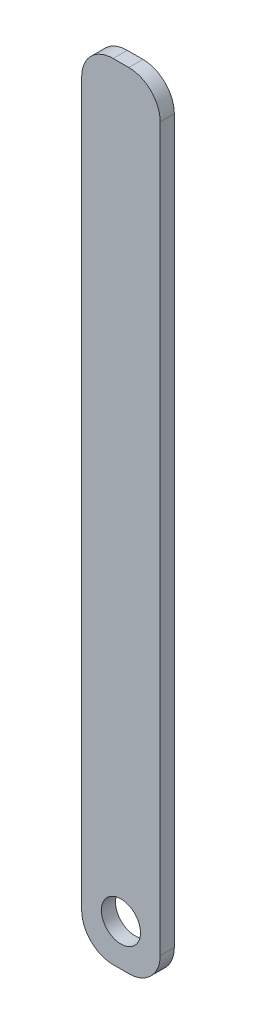
ISO-10303-21;
HEADER;
FILE_DESCRIPTION(('STEP AP214'),'2;1');
FILE_NAME('part.step','',(''),(''),'','','');
FILE_SCHEMA(('AUTOMOTIVE_DESIGN { 1 0 10303 214 1 1 1 1 }'));
ENDSEC;
DATA;
#1=APPLICATION_CONTEXT('core data for automotive mechanical design processes');
#2=APPLICATION_PROTOCOL_DEFINITION('international standard','automotive_design',2000,#1);
#3=PRODUCT_CONTEXT('',#1,'mechanical');
#4=PRODUCT('Part','Part','',(#3));
#5=PRODUCT_RELATED_PRODUCT_CATEGORY('part','',(#4));
#6=PRODUCT_DEFINITION_FORMATION('','',#4);
#7=PRODUCT_DEFINITION_CONTEXT('part definition',#1,'design');
#8=PRODUCT_DEFINITION('design','',#6,#7);
#9=PRODUCT_DEFINITION_SHAPE('','',#8);
#10=(LENGTH_UNIT() NAMED_UNIT(*) SI_UNIT(.MILLI.,.METRE.));
#11=(NAMED_UNIT(*) PLANE_ANGLE_UNIT() SI_UNIT($,.RADIAN.));
#12=(NAMED_UNIT(*) SI_UNIT($,.STERADIAN.) SOLID_ANGLE_UNIT());
#13=UNCERTAINTY_MEASURE_WITH_UNIT(LENGTH_MEASURE(1.E-05),#10,'distance_accuracy_value','');
#14=(GEOMETRIC_REPRESENTATION_CONTEXT(3) GLOBAL_UNCERTAINTY_ASSIGNED_CONTEXT((#13)) GLOBAL_UNIT_ASSIGNED_CONTEXT((#10,
#11,#12)) REPRESENTATION_CONTEXT('',''));
#15=CARTESIAN_POINT('',(0.,0.,0.));
#16=DIRECTION('',(0.,0.,1.));
#17=DIRECTION('',(1.,0.,0.));
#18=AXIS2_PLACEMENT_3D('',#15,#16,#17);
#19=CARTESIAN_POINT('',(-12.7000000000001,-271.4,4.5));
#20=DIRECTION('',(1.,0.,0.));
#21=DIRECTION('',(0.,0.,-1.));
#22=AXIS2_PLACEMENT_3D('',#19,#20,#21);
#23=PLANE('',#22);
#24=DIRECTION('',(0.,-1.,0.));
#25=VECTOR('',#24,1.);
#26=CARTESIAN_POINT('',(-12.7000000000001,-271.4,-4.5));
#27=LINE('',#26,#25);
#28=CARTESIAN_POINT('',(-12.7000000000001,208.6,-4.5));
#29=VERTEX_POINT('',#28);
#30=CARTESIAN_POINT('',(-12.7000000000001,-251.4,-4.5));
#31=VERTEX_POINT('',#30);
#32=EDGE_CURVE('E147',#29,#31,#27,.T.);
#33=ORIENTED_EDGE('',*,*,#32,.T.);
#34=DIRECTION('',(0.,0.,-1.));
#35=VECTOR('',#34,1.);
#36=CARTESIAN_POINT('',(-12.7000000000001,-251.4,4.5));
#37=LINE('',#36,#35);
#38=CARTESIAN_POINT('',(-12.7000000000001,-251.4,4.5));
#39=VERTEX_POINT('',#38);
#40=EDGE_CURVE('E181',#31,#39,#37,.F.);
#41=ORIENTED_EDGE('',*,*,#40,.T.);
#42=DIRECTION('',(0.,-1.,0.));
#43=VECTOR('',#42,1.);
#44=CARTESIAN_POINT('',(-12.7000000000001,-271.4,4.5));
#45=LINE('',#44,#43);
#46=CARTESIAN_POINT('',(-12.7000000000001,208.6,4.5));
#47=VERTEX_POINT('',#46);
#48=EDGE_CURVE('E145',#47,#39,#45,.T.);
#49=ORIENTED_EDGE('',*,*,#48,.F.);
#50=DIRECTION('',(0.,0.,-1.));
#51=VECTOR('',#50,1.);
#52=CARTESIAN_POINT('',(-12.7000000000001,208.6,4.5));
#53=LINE('',#52,#51);
#54=EDGE_CURVE('E177',#47,#29,#53,.T.);
#55=ORIENTED_EDGE('',*,*,#54,.T.);
#56=EDGE_LOOP('',(#33,#41,#49,#55));
#57=FACE_BOUND('',#56,.T.);
#58=ADVANCED_FACE('F45',(#57),#23,.F.);
#59=CARTESIAN_POINT('',(37.2999999999999,-271.4,4.5));
#60=DIRECTION('',(0.,1.,0.));
#61=DIRECTION('',(0.,0.,1.));
#62=AXIS2_PLACEMENT_3D('',#59,#60,#61);
#63=PLANE('',#62);
#64=DIRECTION('',(1.,0.,0.));
#65=VECTOR('',#64,1.);
#66=CARTESIAN_POINT('',(37.2999999999999,-271.4,-4.5));
#67=LINE('',#66,#65);
#68=CARTESIAN_POINT('',(7.29999999999993,-271.4,-4.5));
#69=VERTEX_POINT('',#68);
#70=CARTESIAN_POINT('',(17.2999999999999,-271.4,-4.5));
#71=VERTEX_POINT('',#70);
#72=EDGE_CURVE('E141',#69,#71,#67,.T.);
#73=ORIENTED_EDGE('',*,*,#72,.T.);
#74=DIRECTION('',(0.,0.,-1.));
#75=VECTOR('',#74,1.);
#76=CARTESIAN_POINT('',(17.2999999999999,-271.4,4.5));
#77=LINE('',#76,#75);
#78=CARTESIAN_POINT('',(17.2999999999999,-271.4,4.5));
#79=VERTEX_POINT('',#78);
#80=EDGE_CURVE('E117',#71,#79,#77,.F.);
#81=ORIENTED_EDGE('',*,*,#80,.T.);
#82=DIRECTION('',(1.,0.,0.));
#83=VECTOR('',#82,1.);
#84=CARTESIAN_POINT('',(37.2999999999999,-271.4,4.5));
#85=LINE('',#84,#83);
#86=CARTESIAN_POINT('',(7.29999999999993,-271.4,4.5));
#87=VERTEX_POINT('',#86);
#88=EDGE_CURVE('E201',#87,#79,#85,.T.);
#89=ORIENTED_EDGE('',*,*,#88,.F.);
#90=DIRECTION('',(0.,0.,-1.));
#91=VECTOR('',#90,1.);
#92=CARTESIAN_POINT('',(7.29999999999993,-271.4,4.5));
#93=LINE('',#92,#91);
#94=EDGE_CURVE('E123',#87,#69,#93,.T.);
#95=ORIENTED_EDGE('',*,*,#94,.T.);
#96=EDGE_LOOP('',(#73,#81,#89,#95));
#97=FACE_BOUND('',#96,.T.);
#98=ADVANCED_FACE('F230',(#97),#63,.F.);
#99=CARTESIAN_POINT('',(37.2999999999999,-271.4,4.5));
#100=DIRECTION('',(-1.,0.,0.));
#101=DIRECTION('',(0.,0.,1.));
#102=AXIS2_PLACEMENT_3D('',#99,#100,#101);
#103=PLANE('',#102);
#104=DIRECTION('',(0.,1.,0.));
#105=VECTOR('',#104,1.);
#106=CARTESIAN_POINT('',(37.2999999999999,-271.4,4.5));
#107=LINE('',#106,#105);
#108=CARTESIAN_POINT('',(37.2999999999999,-251.4,4.5));
#109=VERTEX_POINT('',#108);
#110=CARTESIAN_POINT('',(37.2999999999999,208.6,4.5));
#111=VERTEX_POINT('',#110);
#112=EDGE_CURVE('E132',#109,#111,#107,.T.);
#113=ORIENTED_EDGE('',*,*,#112,.F.);
#114=DIRECTION('',(0.,0.,-1.));
#115=VECTOR('',#114,1.);
#116=CARTESIAN_POINT('',(37.2999999999999,-251.4,4.5));
#117=LINE('',#116,#115);
#118=CARTESIAN_POINT('',(37.2999999999999,-251.4,-4.5));
#119=VERTEX_POINT('',#118);
#120=EDGE_CURVE('E116',#109,#119,#117,.T.);
#121=ORIENTED_EDGE('',*,*,#120,.T.);
#122=DIRECTION('',(0.,1.,0.));
#123=VECTOR('',#122,1.);
#124=CARTESIAN_POINT('',(37.2999999999999,-271.4,-4.5));
#125=LINE('',#124,#123);
#126=CARTESIAN_POINT('',(37.2999999999999,208.6,-4.5));
#127=VERTEX_POINT('',#126);
#128=EDGE_CURVE('E130',#119,#127,#125,.T.);
#129=ORIENTED_EDGE('',*,*,#128,.T.);
#130=DIRECTION('',(0.,0.,-1.));
#131=VECTOR('',#130,1.);
#132=CARTESIAN_POINT('',(37.2999999999999,208.6,4.5));
#133=LINE('',#132,#131);
#134=EDGE_CURVE('E135',#127,#111,#133,.F.);
#135=ORIENTED_EDGE('',*,*,#134,.T.);
#136=EDGE_LOOP('',(#113,#121,#129,#135));
#137=FACE_BOUND('',#136,.T.);
#138=ADVANCED_FACE('F129',(#137),#103,.F.);
#139=CARTESIAN_POINT('',(37.2999999999999,228.6,4.5));
#140=DIRECTION('',(0.,-1.,0.));
#141=DIRECTION('',(0.,0.,-1.));
#142=AXIS2_PLACEMENT_3D('',#139,#140,#141);
#143=PLANE('',#142);
#144=DIRECTION('',(-1.,0.,0.));
#145=VECTOR('',#144,1.);
#146=CARTESIAN_POINT('',(37.2999999999999,228.6,-4.5));
#147=LINE('',#146,#145);
#148=CARTESIAN_POINT('',(17.2999999999999,228.6,-4.5));
#149=VERTEX_POINT('',#148);
#150=CARTESIAN_POINT('',(7.29999999999993,228.6,-4.5));
#151=VERTEX_POINT('',#150);
#152=EDGE_CURVE('E140',#149,#151,#147,.T.);
#153=ORIENTED_EDGE('',*,*,#152,.T.);
#154=DIRECTION('',(0.,0.,-1.));
#155=VECTOR('',#154,1.);
#156=CARTESIAN_POINT('',(7.29999999999993,228.6,4.5));
#157=LINE('',#156,#155);
#158=CARTESIAN_POINT('',(7.29999999999993,228.6,4.5));
#159=VERTEX_POINT('',#158);
#160=EDGE_CURVE('E11',#151,#159,#157,.F.);
#161=ORIENTED_EDGE('',*,*,#160,.T.);
#162=DIRECTION('',(-1.,0.,0.));
#163=VECTOR('',#162,1.);
#164=CARTESIAN_POINT('',(37.2999999999999,228.6,4.5));
#165=LINE('',#164,#163);
#166=CARTESIAN_POINT('',(17.2999999999999,228.6,4.5));
#167=VERTEX_POINT('',#166);
#168=EDGE_CURVE('E152',#167,#159,#165,.T.);
#169=ORIENTED_EDGE('',*,*,#168,.F.);
#170=DIRECTION('',(0.,0.,-1.));
#171=VECTOR('',#170,1.);
#172=CARTESIAN_POINT('',(17.2999999999999,228.6,4.5));
#173=LINE('',#172,#171);
#174=EDGE_CURVE('E55',#167,#149,#173,.T.);
#175=ORIENTED_EDGE('',*,*,#174,.T.);
#176=EDGE_LOOP('',(#153,#161,#169,#175));
#177=FACE_BOUND('',#176,.T.);
#178=ADVANCED_FACE('F187',(#177),#143,.F.);
#179=CARTESIAN_POINT('',(0.,0.,4.5));
#180=DIRECTION('',(0.,0.,1.));
#181=DIRECTION('',(1.,0.,0.));
#182=AXIS2_PLACEMENT_3D('',#179,#180,#181);
#183=PLANE('',#182);
#184=CARTESIAN_POINT('',(12.2999999999999,-245.065350927263,4.5));
#185=DIRECTION('',(0.,0.,1.));
#186=DIRECTION('',(1.,0.,0.));
#187=AXIS2_PLACEMENT_3D('',#184,#185,#186);
#188=CIRCLE('',#187,12.4578339949511);
#189=CARTESIAN_POINT('',(24.757833994951,-245.065350927263,4.5));
#190=VERTEX_POINT('',#189);
#191=EDGE_CURVE('E207',#190,#190,#188,.T.);
#192=ORIENTED_EDGE('',*,*,#191,.F.);
#193=EDGE_LOOP('',(#192));
#194=FACE_BOUND('',#193,.T.);
#195=ORIENTED_EDGE('',*,*,#88,.T.);
#196=CARTESIAN_POINT('',(17.2999999999999,-251.4,4.5));
#197=DIRECTION('',(0.,0.,1.));
#198=DIRECTION('',(1.,0.,0.));
#199=AXIS2_PLACEMENT_3D('',#196,#197,#198);
#200=CIRCLE('',#199,20.);
#201=EDGE_CURVE('E174',#79,#109,#200,.T.);
#202=ORIENTED_EDGE('',*,*,#201,.T.);
#203=ORIENTED_EDGE('',*,*,#112,.T.);
#204=CARTESIAN_POINT('',(17.2999999999999,208.6,4.5));
#205=DIRECTION('',(0.,0.,1.));
#206=DIRECTION('',(1.,0.,0.));
#207=AXIS2_PLACEMENT_3D('',#204,#205,#206);
#208=CIRCLE('',#207,20.);
#209=EDGE_CURVE('E67',#111,#167,#208,.T.);
#210=ORIENTED_EDGE('',*,*,#209,.T.);
#211=ORIENTED_EDGE('',*,*,#168,.T.);
#212=CARTESIAN_POINT('',(7.29999999999993,208.6,4.5));
#213=DIRECTION('',(0.,0.,1.));
#214=DIRECTION('',(1.,0.,0.));
#215=AXIS2_PLACEMENT_3D('',#212,#213,#214);
#216=CIRCLE('',#215,20.);
#217=EDGE_CURVE('E168',#159,#47,#216,.T.);
#218=ORIENTED_EDGE('',*,*,#217,.T.);
#219=ORIENTED_EDGE('',*,*,#48,.T.);
#220=CARTESIAN_POINT('',(7.29999999999993,-251.4,4.5));
#221=DIRECTION('',(0.,0.,1.));
#222=DIRECTION('',(1.,0.,0.));
#223=AXIS2_PLACEMENT_3D('',#220,#221,#222);
#224=CIRCLE('',#223,20.);
#225=EDGE_CURVE('E171',#39,#87,#224,.T.);
#226=ORIENTED_EDGE('',*,*,#225,.T.);
#227=EDGE_LOOP('',(#195,#202,#203,#210,#211,#218,#219,#226));
#228=FACE_BOUND('',#227,.T.);
#229=ADVANCED_FACE('F224',(#194,#228),#183,.T.);
#230=CARTESIAN_POINT('',(0.,0.,-4.5));
#231=DIRECTION('',(0.,0.,1.));
#232=DIRECTION('',(1.,0.,0.));
#233=AXIS2_PLACEMENT_3D('',#230,#231,#232);
#234=PLANE('',#233);
#235=CARTESIAN_POINT('',(12.2999999999999,-245.065350927263,-4.5));
#236=DIRECTION('',(0.,0.,1.));
#237=DIRECTION('',(1.,0.,0.));
#238=AXIS2_PLACEMENT_3D('',#235,#236,#237);
#239=CIRCLE('',#238,12.4578339949511);
#240=CARTESIAN_POINT('',(24.757833994951,-245.065350927263,-4.5));
#241=VERTEX_POINT('',#240);
#242=EDGE_CURVE('E49',#241,#241,#239,.T.);
#243=ORIENTED_EDGE('',*,*,#242,.T.);
#244=EDGE_LOOP('',(#243));
#245=FACE_BOUND('',#244,.T.);
#246=ORIENTED_EDGE('',*,*,#128,.F.);
#247=CARTESIAN_POINT('',(17.2999999999999,-251.4,-4.5));
#248=DIRECTION('',(0.,0.,1.));
#249=DIRECTION('',(1.,0.,0.));
#250=AXIS2_PLACEMENT_3D('',#247,#248,#249);
#251=CIRCLE('',#250,20.);
#252=EDGE_CURVE('E112',#119,#71,#251,.F.);
#253=ORIENTED_EDGE('',*,*,#252,.T.);
#254=ORIENTED_EDGE('',*,*,#72,.F.);
#255=CARTESIAN_POINT('',(7.29999999999993,-251.4,-4.5));
#256=DIRECTION('',(0.,0.,1.));
#257=DIRECTION('',(1.,0.,0.));
#258=AXIS2_PLACEMENT_3D('',#255,#256,#257);
#259=CIRCLE('',#258,20.);
#260=EDGE_CURVE('E124',#69,#31,#259,.F.);
#261=ORIENTED_EDGE('',*,*,#260,.T.);
#262=ORIENTED_EDGE('',*,*,#32,.F.);
#263=CARTESIAN_POINT('',(7.29999999999993,208.6,-4.5));
#264=DIRECTION('',(0.,0.,1.));
#265=DIRECTION('',(1.,0.,0.));
#266=AXIS2_PLACEMENT_3D('',#263,#264,#265);
#267=CIRCLE('',#266,20.);
#268=EDGE_CURVE('E156',#29,#151,#267,.F.);
#269=ORIENTED_EDGE('',*,*,#268,.T.);
#270=ORIENTED_EDGE('',*,*,#152,.F.);
#271=CARTESIAN_POINT('',(17.2999999999999,208.6,-4.5));
#272=DIRECTION('',(0.,0.,1.));
#273=DIRECTION('',(1.,0.,0.));
#274=AXIS2_PLACEMENT_3D('',#271,#272,#273);
#275=CIRCLE('',#274,20.);
#276=EDGE_CURVE('E134',#149,#127,#275,.F.);
#277=ORIENTED_EDGE('',*,*,#276,.T.);
#278=EDGE_LOOP('',(#246,#253,#254,#261,#262,#269,#270,#277));
#279=FACE_BOUND('',#278,.T.);
#280=ADVANCED_FACE('F137',(#245,#279),#234,.F.);
#281=CARTESIAN_POINT('',(17.2999999999999,-251.4,4.5));
#282=DIRECTION('',(0.,0.,-1.));
#283=DIRECTION('',(-1.,0.,0.));
#284=AXIS2_PLACEMENT_3D('',#281,#282,#283);
#285=CYLINDRICAL_SURFACE('',#284,20.);
#286=ORIENTED_EDGE('',*,*,#201,.F.);
#287=ORIENTED_EDGE('',*,*,#80,.F.);
#288=ORIENTED_EDGE('',*,*,#252,.F.);
#289=ORIENTED_EDGE('',*,*,#120,.F.);
#290=EDGE_LOOP('',(#286,#287,#288,#289));
#291=FACE_BOUND('',#290,.T.);
#292=ADVANCED_FACE('F115',(#291),#285,.T.);
#293=CARTESIAN_POINT('',(7.29999999999993,-251.4,4.5));
#294=DIRECTION('',(0.,0.,-1.));
#295=DIRECTION('',(-1.,0.,0.));
#296=AXIS2_PLACEMENT_3D('',#293,#294,#295);
#297=CYLINDRICAL_SURFACE('',#296,20.);
#298=ORIENTED_EDGE('',*,*,#225,.F.);
#299=ORIENTED_EDGE('',*,*,#40,.F.);
#300=ORIENTED_EDGE('',*,*,#260,.F.);
#301=ORIENTED_EDGE('',*,*,#94,.F.);
#302=EDGE_LOOP('',(#298,#299,#300,#301));
#303=FACE_BOUND('',#302,.T.);
#304=ADVANCED_FACE('F232',(#303),#297,.T.);
#305=CARTESIAN_POINT('',(7.29999999999993,208.6,4.5));
#306=DIRECTION('',(0.,0.,-1.));
#307=DIRECTION('',(-1.,0.,0.));
#308=AXIS2_PLACEMENT_3D('',#305,#306,#307);
#309=CYLINDRICAL_SURFACE('',#308,20.);
#310=ORIENTED_EDGE('',*,*,#217,.F.);
#311=ORIENTED_EDGE('',*,*,#160,.F.);
#312=ORIENTED_EDGE('',*,*,#268,.F.);
#313=ORIENTED_EDGE('',*,*,#54,.F.);
#314=EDGE_LOOP('',(#310,#311,#312,#313));
#315=FACE_BOUND('',#314,.T.);
#316=ADVANCED_FACE('F194',(#315),#309,.T.);
#317=CARTESIAN_POINT('',(17.2999999999999,208.6,4.5));
#318=DIRECTION('',(0.,0.,-1.));
#319=DIRECTION('',(-1.,0.,0.));
#320=AXIS2_PLACEMENT_3D('',#317,#318,#319);
#321=CYLINDRICAL_SURFACE('',#320,20.);
#322=ORIENTED_EDGE('',*,*,#209,.F.);
#323=ORIENTED_EDGE('',*,*,#134,.F.);
#324=ORIENTED_EDGE('',*,*,#276,.F.);
#325=ORIENTED_EDGE('',*,*,#174,.F.);
#326=EDGE_LOOP('',(#322,#323,#324,#325));
#327=FACE_BOUND('',#326,.T.);
#328=ADVANCED_FACE('F47',(#327),#321,.T.);
#329=CARTESIAN_POINT('',(12.2999999999999,-245.065350927263,-5.5));
#330=DIRECTION('',(0.,0.,1.));
#331=DIRECTION('',(1.,0.,0.));
#332=AXIS2_PLACEMENT_3D('',#329,#330,#331);
#333=CYLINDRICAL_SURFACE('',#332,12.4578339949511);
#334=ORIENTED_EDGE('',*,*,#191,.T.);
#335=EDGE_LOOP('',(#334));
#336=FACE_BOUND('',#335,.T.);
#337=ORIENTED_EDGE('',*,*,#242,.F.);
#338=EDGE_LOOP('',(#337));
#339=FACE_BOUND('',#338,.T.);
#340=ADVANCED_FACE('F221',(#336,#339),#333,.F.);
#341=CLOSED_SHELL('',(#58,#98,#138,#178,#229,#280,#292,#304,#316,#328,#340));
#342=MANIFOLD_SOLID_BREP('B2',#341);
#343=ADVANCED_BREP_SHAPE_REPRESENTATION('',(#18,#342),#14);
#344=SHAPE_DEFINITION_REPRESENTATION(#9,#343);
ENDSEC;
END-ISO-10303-21;
